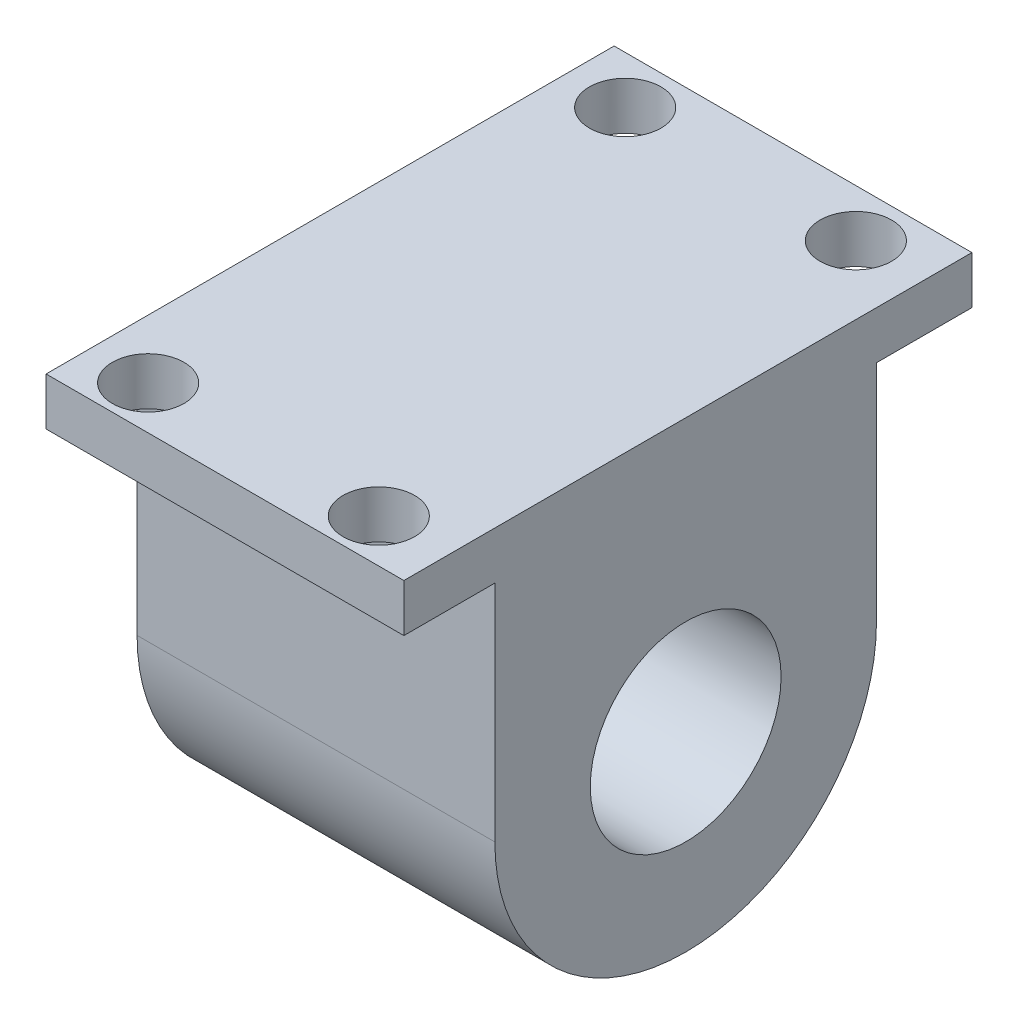
ISO-10303-21;
HEADER;
FILE_DESCRIPTION(('STEP AP214'),'2;1');
FILE_NAME('part.step','',(''),(''),'','','');
FILE_SCHEMA(('AUTOMOTIVE_DESIGN { 1 0 10303 214 1 1 1 1 }'));
ENDSEC;
DATA;
#1=APPLICATION_CONTEXT('core data for automotive mechanical design processes');
#2=APPLICATION_PROTOCOL_DEFINITION('international standard','automotive_design',2000,#1);
#3=PRODUCT_CONTEXT('',#1,'mechanical');
#4=PRODUCT('Part','Part','',(#3));
#5=PRODUCT_RELATED_PRODUCT_CATEGORY('part','',(#4));
#6=PRODUCT_DEFINITION_FORMATION('','',#4);
#7=PRODUCT_DEFINITION_CONTEXT('part definition',#1,'design');
#8=PRODUCT_DEFINITION('design','',#6,#7);
#9=PRODUCT_DEFINITION_SHAPE('','',#8);
#10=(LENGTH_UNIT() NAMED_UNIT(*) SI_UNIT(.MILLI.,.METRE.));
#11=(NAMED_UNIT(*) PLANE_ANGLE_UNIT() SI_UNIT($,.RADIAN.));
#12=(NAMED_UNIT(*) SI_UNIT($,.STERADIAN.) SOLID_ANGLE_UNIT());
#13=UNCERTAINTY_MEASURE_WITH_UNIT(LENGTH_MEASURE(1.E-05),#10,'distance_accuracy_value','');
#14=(GEOMETRIC_REPRESENTATION_CONTEXT(3) GLOBAL_UNCERTAINTY_ASSIGNED_CONTEXT((#13)) GLOBAL_UNIT_ASSIGNED_CONTEXT((#10,
#11,#12)) REPRESENTATION_CONTEXT('',''));
#15=CARTESIAN_POINT('',(0.,0.,0.));
#16=DIRECTION('',(0.,0.,1.));
#17=DIRECTION('',(1.,0.,0.));
#18=AXIS2_PLACEMENT_3D('',#15,#16,#17);
#19=CARTESIAN_POINT('',(15.,0.,8.));
#20=DIRECTION('',(0.,0.,1.));
#21=DIRECTION('',(1.,0.,0.));
#22=AXIS2_PLACEMENT_3D('',#19,#20,#21);
#23=PLANE('',#22);
#24=DIRECTION('',(0.,1.,0.));
#25=VECTOR('',#24,1.);
#26=CARTESIAN_POINT('',(0.,0.,8.));
#27=LINE('',#26,#25);
#28=CARTESIAN_POINT('',(0.,0.,8.));
#29=VERTEX_POINT('',#28);
#30=CARTESIAN_POINT('',(0.,9.4,8.));
#31=VERTEX_POINT('',#30);
#32=EDGE_CURVE('E138',#29,#31,#27,.T.);
#33=ORIENTED_EDGE('',*,*,#32,.F.);
#34=DIRECTION('',(-1.,0.,0.));
#35=VECTOR('',#34,1.);
#36=CARTESIAN_POINT('',(15.,0.,8.));
#37=LINE('',#36,#35);
#38=CARTESIAN_POINT('',(15.,0.,8.));
#39=VERTEX_POINT('',#38);
#40=EDGE_CURVE('E11',#39,#29,#37,.T.);
#41=ORIENTED_EDGE('',*,*,#40,.F.);
#42=DIRECTION('',(0.,1.,0.));
#43=VECTOR('',#42,1.);
#44=CARTESIAN_POINT('',(15.,0.,8.));
#45=LINE('',#44,#43);
#46=CARTESIAN_POINT('',(15.,9.4,8.));
#47=VERTEX_POINT('',#46);
#48=EDGE_CURVE('E185',#39,#47,#45,.T.);
#49=ORIENTED_EDGE('',*,*,#48,.T.);
#50=DIRECTION('',(-1.,0.,0.));
#51=VECTOR('',#50,1.);
#52=CARTESIAN_POINT('',(15.,9.4,8.));
#53=LINE('',#52,#51);
#54=EDGE_CURVE('E89',#47,#31,#53,.T.);
#55=ORIENTED_EDGE('',*,*,#54,.T.);
#56=EDGE_LOOP('',(#33,#41,#49,#55));
#57=FACE_BOUND('',#56,.T.);
#58=ADVANCED_FACE('F35',(#57),#23,.T.);
#59=CARTESIAN_POINT('',(15.,0.,0.));
#60=DIRECTION('',(-1.,0.,0.));
#61=DIRECTION('',(0.,0.,1.));
#62=AXIS2_PLACEMENT_3D('',#59,#60,#61);
#63=CYLINDRICAL_SURFACE('',#62,8.);
#64=CARTESIAN_POINT('',(0.,0.,0.));
#65=DIRECTION('',(1.,0.,0.));
#66=DIRECTION('',(0.,0.,-1.));
#67=AXIS2_PLACEMENT_3D('',#64,#65,#66);
#68=CIRCLE('',#67,8.);
#69=CARTESIAN_POINT('',(0.,0.,-8.));
#70=VERTEX_POINT('',#69);
#71=EDGE_CURVE('E140',#29,#70,#68,.T.);
#72=ORIENTED_EDGE('',*,*,#71,.T.);
#73=DIRECTION('',(-1.,0.,0.));
#74=VECTOR('',#73,1.);
#75=CARTESIAN_POINT('',(15.,0.,-8.));
#76=LINE('',#75,#74);
#77=CARTESIAN_POINT('',(15.,0.,-8.));
#78=VERTEX_POINT('',#77);
#79=EDGE_CURVE('E45',#78,#70,#76,.T.);
#80=ORIENTED_EDGE('',*,*,#79,.F.);
#81=CARTESIAN_POINT('',(15.,0.,0.));
#82=DIRECTION('',(1.,0.,0.));
#83=DIRECTION('',(0.,0.,-1.));
#84=AXIS2_PLACEMENT_3D('',#81,#82,#83);
#85=CIRCLE('',#84,8.);
#86=EDGE_CURVE('E187',#39,#78,#85,.T.);
#87=ORIENTED_EDGE('',*,*,#86,.F.);
#88=ORIENTED_EDGE('',*,*,#40,.T.);
#89=EDGE_LOOP('',(#72,#80,#87,#88));
#90=FACE_BOUND('',#89,.T.);
#91=ADVANCED_FACE('F216',(#90),#63,.T.);
#92=CARTESIAN_POINT('',(15.,0.,-8.));
#93=DIRECTION('',(0.,0.,1.));
#94=DIRECTION('',(1.,0.,0.));
#95=AXIS2_PLACEMENT_3D('',#92,#93,#94);
#96=PLANE('',#95);
#97=DIRECTION('',(0.,1.,0.));
#98=VECTOR('',#97,1.);
#99=CARTESIAN_POINT('',(0.,0.,-8.));
#100=LINE('',#99,#98);
#101=CARTESIAN_POINT('',(0.,9.4,-8.));
#102=VERTEX_POINT('',#101);
#103=EDGE_CURVE('E143',#70,#102,#100,.T.);
#104=ORIENTED_EDGE('',*,*,#103,.T.);
#105=DIRECTION('',(-1.,0.,0.));
#106=VECTOR('',#105,1.);
#107=CARTESIAN_POINT('',(15.,9.4,-8.));
#108=LINE('',#107,#106);
#109=CARTESIAN_POINT('',(15.,9.4,-8.));
#110=VERTEX_POINT('',#109);
#111=EDGE_CURVE('E162',#110,#102,#108,.T.);
#112=ORIENTED_EDGE('',*,*,#111,.F.);
#113=DIRECTION('',(0.,1.,0.));
#114=VECTOR('',#113,1.);
#115=CARTESIAN_POINT('',(15.,0.,-8.));
#116=LINE('',#115,#114);
#117=EDGE_CURVE('E190',#78,#110,#116,.T.);
#118=ORIENTED_EDGE('',*,*,#117,.F.);
#119=ORIENTED_EDGE('',*,*,#79,.T.);
#120=EDGE_LOOP('',(#104,#112,#118,#119));
#121=FACE_BOUND('',#120,.T.);
#122=ADVANCED_FACE('F220',(#121),#96,.F.);
#123=CARTESIAN_POINT('',(15.,9.4,0.));
#124=DIRECTION('',(0.,1.,0.));
#125=DIRECTION('',(0.,0.,1.));
#126=AXIS2_PLACEMENT_3D('',#123,#124,#125);
#127=PLANE('',#126);
#128=CARTESIAN_POINT('',(2.46436263819966,9.4,-10.));
#129=DIRECTION('',(0.,-1.,0.));
#130=DIRECTION('',(0.,0.,-1.));
#131=AXIS2_PLACEMENT_3D('',#128,#129,#130);
#132=CIRCLE('',#131,1.5);
#133=CARTESIAN_POINT('',(2.46436263819966,9.4,-11.5));
#134=VERTEX_POINT('',#133);
#135=EDGE_CURVE('E168',#134,#134,#132,.T.);
#136=ORIENTED_EDGE('',*,*,#135,.F.);
#137=EDGE_LOOP('',(#136));
#138=FACE_BOUND('',#137,.T.);
#139=CARTESIAN_POINT('',(12.1341247482349,9.4,-10.));
#140=DIRECTION('',(0.,-1.,0.));
#141=DIRECTION('',(0.,0.,-1.));
#142=AXIS2_PLACEMENT_3D('',#139,#140,#141);
#143=CIRCLE('',#142,1.5);
#144=CARTESIAN_POINT('',(12.1341247482349,9.4,-11.5));
#145=VERTEX_POINT('',#144);
#146=EDGE_CURVE('E173',#145,#145,#143,.T.);
#147=ORIENTED_EDGE('',*,*,#146,.F.);
#148=EDGE_LOOP('',(#147));
#149=FACE_BOUND('',#148,.T.);
#150=DIRECTION('',(0.,0.,-1.));
#151=VECTOR('',#150,1.);
#152=CARTESIAN_POINT('',(0.,9.4,0.));
#153=LINE('',#152,#151);
#154=CARTESIAN_POINT('',(0.,9.4,-12.));
#155=VERTEX_POINT('',#154);
#156=EDGE_CURVE('E146',#102,#155,#153,.T.);
#157=ORIENTED_EDGE('',*,*,#156,.T.);
#158=DIRECTION('',(-1.,0.,0.));
#159=VECTOR('',#158,1.);
#160=CARTESIAN_POINT('',(15.,9.4,-12.));
#161=LINE('',#160,#159);
#162=CARTESIAN_POINT('',(15.,9.4,-12.));
#163=VERTEX_POINT('',#162);
#164=EDGE_CURVE('E160',#163,#155,#161,.T.);
#165=ORIENTED_EDGE('',*,*,#164,.F.);
#166=DIRECTION('',(0.,0.,-1.));
#167=VECTOR('',#166,1.);
#168=CARTESIAN_POINT('',(15.,9.4,0.));
#169=LINE('',#168,#167);
#170=EDGE_CURVE('E130',#110,#163,#169,.T.);
#171=ORIENTED_EDGE('',*,*,#170,.F.);
#172=ORIENTED_EDGE('',*,*,#111,.T.);
#173=EDGE_LOOP('',(#157,#165,#171,#172));
#174=FACE_BOUND('',#173,.T.);
#175=ADVANCED_FACE('F195',(#138,#149,#174),#127,.F.);
#176=CARTESIAN_POINT('',(15.,0.,-12.));
#177=DIRECTION('',(0.,0.,-1.));
#178=DIRECTION('',(-1.,0.,0.));
#179=AXIS2_PLACEMENT_3D('',#176,#177,#178);
#180=PLANE('',#179);
#181=DIRECTION('',(0.,-1.,0.));
#182=VECTOR('',#181,1.);
#183=CARTESIAN_POINT('',(0.,0.,-12.));
#184=LINE('',#183,#182);
#185=CARTESIAN_POINT('',(0.,11.4,-12.));
#186=VERTEX_POINT('',#185);
#187=EDGE_CURVE('E149',#186,#155,#184,.T.);
#188=ORIENTED_EDGE('',*,*,#187,.F.);
#189=DIRECTION('',(-1.,0.,0.));
#190=VECTOR('',#189,1.);
#191=CARTESIAN_POINT('',(15.,11.4,-12.));
#192=LINE('',#191,#190);
#193=CARTESIAN_POINT('',(15.,11.4,-12.));
#194=VERTEX_POINT('',#193);
#195=EDGE_CURVE('E118',#194,#186,#192,.T.);
#196=ORIENTED_EDGE('',*,*,#195,.F.);
#197=DIRECTION('',(0.,-1.,0.));
#198=VECTOR('',#197,1.);
#199=CARTESIAN_POINT('',(15.,0.,-12.));
#200=LINE('',#199,#198);
#201=EDGE_CURVE('E128',#194,#163,#200,.T.);
#202=ORIENTED_EDGE('',*,*,#201,.T.);
#203=ORIENTED_EDGE('',*,*,#164,.T.);
#204=EDGE_LOOP('',(#188,#196,#202,#203));
#205=FACE_BOUND('',#204,.T.);
#206=ADVANCED_FACE('F198',(#205),#180,.T.);
#207=CARTESIAN_POINT('',(15.,11.4,0.));
#208=DIRECTION('',(0.,1.,0.));
#209=DIRECTION('',(0.,0.,1.));
#210=AXIS2_PLACEMENT_3D('',#207,#208,#209);
#211=PLANE('',#210);
#212=CARTESIAN_POINT('',(2.46436263819966,11.4,10.));
#213=DIRECTION('',(0.,1.,0.));
#214=DIRECTION('',(0.,0.,1.));
#215=AXIS2_PLACEMENT_3D('',#212,#213,#214);
#216=CIRCLE('',#215,1.5);
#217=CARTESIAN_POINT('',(2.46436263819966,11.4,11.5));
#218=VERTEX_POINT('',#217);
#219=EDGE_CURVE('E178',#218,#218,#216,.F.);
#220=ORIENTED_EDGE('',*,*,#219,.T.);
#221=EDGE_LOOP('',(#220));
#222=FACE_BOUND('',#221,.T.);
#223=CARTESIAN_POINT('',(12.1341247482349,11.4,10.));
#224=DIRECTION('',(0.,1.,0.));
#225=DIRECTION('',(0.,0.,1.));
#226=AXIS2_PLACEMENT_3D('',#223,#224,#225);
#227=CIRCLE('',#226,1.5);
#228=CARTESIAN_POINT('',(12.1341247482349,11.4,11.5));
#229=VERTEX_POINT('',#228);
#230=EDGE_CURVE('E253',#229,#229,#227,.F.);
#231=ORIENTED_EDGE('',*,*,#230,.T.);
#232=EDGE_LOOP('',(#231));
#233=FACE_BOUND('',#232,.T.);
#234=CARTESIAN_POINT('',(2.46436263819966,11.4,-10.));
#235=DIRECTION('',(0.,1.,0.));
#236=DIRECTION('',(0.,0.,1.));
#237=AXIS2_PLACEMENT_3D('',#234,#235,#236);
#238=CIRCLE('',#237,1.5);
#239=CARTESIAN_POINT('',(2.46436263819966,11.4,-8.5));
#240=VERTEX_POINT('',#239);
#241=EDGE_CURVE('E39',#240,#240,#238,.T.);
#242=ORIENTED_EDGE('',*,*,#241,.F.);
#243=EDGE_LOOP('',(#242));
#244=FACE_BOUND('',#243,.T.);
#245=CARTESIAN_POINT('',(12.1341247482349,11.4,-10.));
#246=DIRECTION('',(0.,1.,0.));
#247=DIRECTION('',(0.,0.,1.));
#248=AXIS2_PLACEMENT_3D('',#245,#246,#247);
#249=CIRCLE('',#248,1.5);
#250=CARTESIAN_POINT('',(12.1341247482349,11.4,-8.5));
#251=VERTEX_POINT('',#250);
#252=EDGE_CURVE('E166',#251,#251,#249,.T.);
#253=ORIENTED_EDGE('',*,*,#252,.F.);
#254=EDGE_LOOP('',(#253));
#255=FACE_BOUND('',#254,.T.);
#256=DIRECTION('',(0.,0.,-1.));
#257=VECTOR('',#256,1.);
#258=CARTESIAN_POINT('',(0.,11.4,0.));
#259=LINE('',#258,#257);
#260=CARTESIAN_POINT('',(0.,11.4,11.8149810451375));
#261=VERTEX_POINT('',#260);
#262=EDGE_CURVE('E115',#261,#186,#259,.T.);
#263=ORIENTED_EDGE('',*,*,#262,.F.);
#264=DIRECTION('',(-1.,0.,0.));
#265=VECTOR('',#264,1.);
#266=CARTESIAN_POINT('',(15.,11.4,11.8149810451375));
#267=LINE('',#266,#265);
#268=CARTESIAN_POINT('',(15.,11.4,11.8149810451375));
#269=VERTEX_POINT('',#268);
#270=EDGE_CURVE('E109',#269,#261,#267,.T.);
#271=ORIENTED_EDGE('',*,*,#270,.F.);
#272=DIRECTION('',(0.,0.,-1.));
#273=VECTOR('',#272,1.);
#274=CARTESIAN_POINT('',(15.,11.4,0.));
#275=LINE('',#274,#273);
#276=EDGE_CURVE('E113',#269,#194,#275,.T.);
#277=ORIENTED_EDGE('',*,*,#276,.T.);
#278=ORIENTED_EDGE('',*,*,#195,.T.);
#279=EDGE_LOOP('',(#263,#271,#277,#278));
#280=FACE_BOUND('',#279,.T.);
#281=ADVANCED_FACE('F111',(#222,#233,#244,#255,#280),#211,.T.);
#282=CARTESIAN_POINT('',(15.,0.,11.8149810451375));
#283=DIRECTION('',(0.,0.,-1.));
#284=DIRECTION('',(-1.,0.,0.));
#285=AXIS2_PLACEMENT_3D('',#282,#283,#284);
#286=PLANE('',#285);
#287=DIRECTION('',(0.,-1.,0.));
#288=VECTOR('',#287,1.);
#289=CARTESIAN_POINT('',(0.,0.,11.8149810451375));
#290=LINE('',#289,#288);
#291=CARTESIAN_POINT('',(0.,9.4,11.8149810451375));
#292=VERTEX_POINT('',#291);
#293=EDGE_CURVE('E153',#261,#292,#290,.T.);
#294=ORIENTED_EDGE('',*,*,#293,.T.);
#295=DIRECTION('',(-1.,0.,0.));
#296=VECTOR('',#295,1.);
#297=CARTESIAN_POINT('',(15.,9.4,11.8149810451375));
#298=LINE('',#297,#296);
#299=CARTESIAN_POINT('',(15.,9.4,11.8149810451375));
#300=VERTEX_POINT('',#299);
#301=EDGE_CURVE('E119',#300,#292,#298,.T.);
#302=ORIENTED_EDGE('',*,*,#301,.F.);
#303=DIRECTION('',(0.,-1.,0.));
#304=VECTOR('',#303,1.);
#305=CARTESIAN_POINT('',(15.,0.,11.8149810451375));
#306=LINE('',#305,#304);
#307=EDGE_CURVE('E122',#269,#300,#306,.T.);
#308=ORIENTED_EDGE('',*,*,#307,.F.);
#309=ORIENTED_EDGE('',*,*,#270,.T.);
#310=EDGE_LOOP('',(#294,#302,#308,#309));
#311=FACE_BOUND('',#310,.T.);
#312=ADVANCED_FACE('F123',(#311),#286,.F.);
#313=CARTESIAN_POINT('',(15.,0.,0.));
#314=DIRECTION('',(-1.,0.,0.));
#315=DIRECTION('',(0.,0.,1.));
#316=AXIS2_PLACEMENT_3D('',#313,#314,#315);
#317=CYLINDRICAL_SURFACE('',#316,4.);
#318=CARTESIAN_POINT('',(15.,0.,0.));
#319=DIRECTION('',(1.,0.,0.));
#320=DIRECTION('',(0.,0.,-1.));
#321=AXIS2_PLACEMENT_3D('',#318,#319,#320);
#322=CIRCLE('',#321,4.);
#323=CARTESIAN_POINT('',(15.,0.,-4.));
#324=VERTEX_POINT('',#323);
#325=EDGE_CURVE('E156',#324,#324,#322,.T.);
#326=ORIENTED_EDGE('',*,*,#325,.T.);
#327=EDGE_LOOP('',(#326));
#328=FACE_BOUND('',#327,.T.);
#329=CARTESIAN_POINT('',(0.,0.,0.));
#330=DIRECTION('',(1.,0.,0.));
#331=DIRECTION('',(0.,0.,-1.));
#332=AXIS2_PLACEMENT_3D('',#329,#330,#331);
#333=CIRCLE('',#332,4.);
#334=CARTESIAN_POINT('',(0.,0.,-4.));
#335=VERTEX_POINT('',#334);
#336=EDGE_CURVE('E135',#335,#335,#333,.T.);
#337=ORIENTED_EDGE('',*,*,#336,.F.);
#338=EDGE_LOOP('',(#337));
#339=FACE_BOUND('',#338,.T.);
#340=ADVANCED_FACE('F37',(#328,#339),#317,.F.);
#341=CARTESIAN_POINT('',(15.,9.4,0.));
#342=DIRECTION('',(0.,1.,0.));
#343=DIRECTION('',(0.,0.,1.));
#344=AXIS2_PLACEMENT_3D('',#341,#342,#343);
#345=PLANE('',#344);
#346=CARTESIAN_POINT('',(2.46436263819966,9.4,10.));
#347=DIRECTION('',(0.,1.,0.));
#348=DIRECTION('',(0.,0.,1.));
#349=AXIS2_PLACEMENT_3D('',#346,#347,#348);
#350=CIRCLE('',#349,1.5);
#351=CARTESIAN_POINT('',(2.46436263819966,9.4,11.5));
#352=VERTEX_POINT('',#351);
#353=EDGE_CURVE('E245',#352,#352,#350,.T.);
#354=ORIENTED_EDGE('',*,*,#353,.T.);
#355=EDGE_LOOP('',(#354));
#356=FACE_BOUND('',#355,.T.);
#357=CARTESIAN_POINT('',(12.1341247482349,9.4,10.));
#358=DIRECTION('',(0.,1.,0.));
#359=DIRECTION('',(0.,0.,1.));
#360=AXIS2_PLACEMENT_3D('',#357,#358,#359);
#361=CIRCLE('',#360,1.5);
#362=CARTESIAN_POINT('',(12.1341247482349,9.4,11.5));
#363=VERTEX_POINT('',#362);
#364=EDGE_CURVE('E249',#363,#363,#361,.T.);
#365=ORIENTED_EDGE('',*,*,#364,.T.);
#366=EDGE_LOOP('',(#365));
#367=FACE_BOUND('',#366,.T.);
#368=DIRECTION('',(0.,0.,-1.));
#369=VECTOR('',#368,1.);
#370=CARTESIAN_POINT('',(0.,9.4,0.));
#371=LINE('',#370,#369);
#372=EDGE_CURVE('E82',#292,#31,#371,.T.);
#373=ORIENTED_EDGE('',*,*,#372,.T.);
#374=ORIENTED_EDGE('',*,*,#54,.F.);
#375=DIRECTION('',(0.,0.,-1.));
#376=VECTOR('',#375,1.);
#377=CARTESIAN_POINT('',(15.,9.4,0.));
#378=LINE('',#377,#376);
#379=EDGE_CURVE('E54',#300,#47,#378,.T.);
#380=ORIENTED_EDGE('',*,*,#379,.F.);
#381=ORIENTED_EDGE('',*,*,#301,.T.);
#382=EDGE_LOOP('',(#373,#374,#380,#381));
#383=FACE_BOUND('',#382,.T.);
#384=ADVANCED_FACE('F211',(#356,#367,#383),#345,.F.);
#385=CARTESIAN_POINT('',(15.,0.,0.));
#386=DIRECTION('',(1.,0.,0.));
#387=DIRECTION('',(0.,0.,-1.));
#388=AXIS2_PLACEMENT_3D('',#385,#386,#387);
#389=PLANE('',#388);
#390=ORIENTED_EDGE('',*,*,#325,.F.);
#391=EDGE_LOOP('',(#390));
#392=FACE_BOUND('',#391,.T.);
#393=ORIENTED_EDGE('',*,*,#48,.F.);
#394=ORIENTED_EDGE('',*,*,#86,.T.);
#395=ORIENTED_EDGE('',*,*,#117,.T.);
#396=ORIENTED_EDGE('',*,*,#170,.T.);
#397=ORIENTED_EDGE('',*,*,#201,.F.);
#398=ORIENTED_EDGE('',*,*,#276,.F.);
#399=ORIENTED_EDGE('',*,*,#307,.T.);
#400=ORIENTED_EDGE('',*,*,#379,.T.);
#401=EDGE_LOOP('',(#393,#394,#395,#396,#397,#398,#399,#400));
#402=FACE_BOUND('',#401,.T.);
#403=ADVANCED_FACE('F126',(#392,#402),#389,.T.);
#404=CARTESIAN_POINT('',(0.,0.,0.));
#405=DIRECTION('',(1.,0.,0.));
#406=DIRECTION('',(0.,0.,-1.));
#407=AXIS2_PLACEMENT_3D('',#404,#405,#406);
#408=PLANE('',#407);
#409=ORIENTED_EDGE('',*,*,#336,.T.);
#410=EDGE_LOOP('',(#409));
#411=FACE_BOUND('',#410,.T.);
#412=ORIENTED_EDGE('',*,*,#32,.T.);
#413=ORIENTED_EDGE('',*,*,#372,.F.);
#414=ORIENTED_EDGE('',*,*,#293,.F.);
#415=ORIENTED_EDGE('',*,*,#262,.T.);
#416=ORIENTED_EDGE('',*,*,#187,.T.);
#417=ORIENTED_EDGE('',*,*,#156,.F.);
#418=ORIENTED_EDGE('',*,*,#103,.F.);
#419=ORIENTED_EDGE('',*,*,#71,.F.);
#420=EDGE_LOOP('',(#412,#413,#414,#415,#416,#417,#418,#419));
#421=FACE_BOUND('',#420,.T.);
#422=ADVANCED_FACE('F199',(#411,#421),#408,.F.);
#423=CARTESIAN_POINT('',(12.1341247482349,24.4,-10.));
#424=DIRECTION('',(0.,-1.,0.));
#425=DIRECTION('',(0.,0.,-1.));
#426=AXIS2_PLACEMENT_3D('',#423,#424,#425);
#427=CYLINDRICAL_SURFACE('',#426,1.5);
#428=ORIENTED_EDGE('',*,*,#252,.T.);
#429=EDGE_LOOP('',(#428));
#430=FACE_BOUND('',#429,.T.);
#431=ORIENTED_EDGE('',*,*,#146,.T.);
#432=EDGE_LOOP('',(#431));
#433=FACE_BOUND('',#432,.T.);
#434=ADVANCED_FACE('F202',(#430,#433),#427,.F.);
#435=CARTESIAN_POINT('',(2.46436263819966,24.4,-10.));
#436=DIRECTION('',(0.,-1.,0.));
#437=DIRECTION('',(0.,0.,-1.));
#438=AXIS2_PLACEMENT_3D('',#435,#436,#437);
#439=CYLINDRICAL_SURFACE('',#438,1.5);
#440=ORIENTED_EDGE('',*,*,#241,.T.);
#441=EDGE_LOOP('',(#440));
#442=FACE_BOUND('',#441,.T.);
#443=ORIENTED_EDGE('',*,*,#135,.T.);
#444=EDGE_LOOP('',(#443));
#445=FACE_BOUND('',#444,.T.);
#446=ADVANCED_FACE('F209',(#442,#445),#439,.F.);
#447=CARTESIAN_POINT('',(12.1341247482349,24.4,10.));
#448=DIRECTION('',(0.,-1.,0.));
#449=DIRECTION('',(0.,0.,-1.));
#450=AXIS2_PLACEMENT_3D('',#447,#448,#449);
#451=CYLINDRICAL_SURFACE('',#450,1.5);
#452=ORIENTED_EDGE('',*,*,#230,.F.);
#453=EDGE_LOOP('',(#452));
#454=FACE_BOUND('',#453,.T.);
#455=ORIENTED_EDGE('',*,*,#364,.F.);
#456=EDGE_LOOP('',(#455));
#457=FACE_BOUND('',#456,.T.);
#458=ADVANCED_FACE('F264',(#454,#457),#451,.F.);
#459=CARTESIAN_POINT('',(2.46436263819966,24.4,10.));
#460=DIRECTION('',(0.,-1.,0.));
#461=DIRECTION('',(0.,0.,-1.));
#462=AXIS2_PLACEMENT_3D('',#459,#460,#461);
#463=CYLINDRICAL_SURFACE('',#462,1.5);
#464=ORIENTED_EDGE('',*,*,#219,.F.);
#465=EDGE_LOOP('',(#464));
#466=FACE_BOUND('',#465,.T.);
#467=ORIENTED_EDGE('',*,*,#353,.F.);
#468=EDGE_LOOP('',(#467));
#469=FACE_BOUND('',#468,.T.);
#470=ADVANCED_FACE('F261',(#466,#469),#463,.F.);
#471=CLOSED_SHELL('',(#58,#91,#122,#175,#206,#281,#312,#340,#384,#403,#422,#434,#446,#458,#470));
#472=MANIFOLD_SOLID_BREP('B2',#471);
#473=ADVANCED_BREP_SHAPE_REPRESENTATION('',(#18,#472),#14);
#474=SHAPE_DEFINITION_REPRESENTATION(#9,#473);
ENDSEC;
END-ISO-10303-21;
